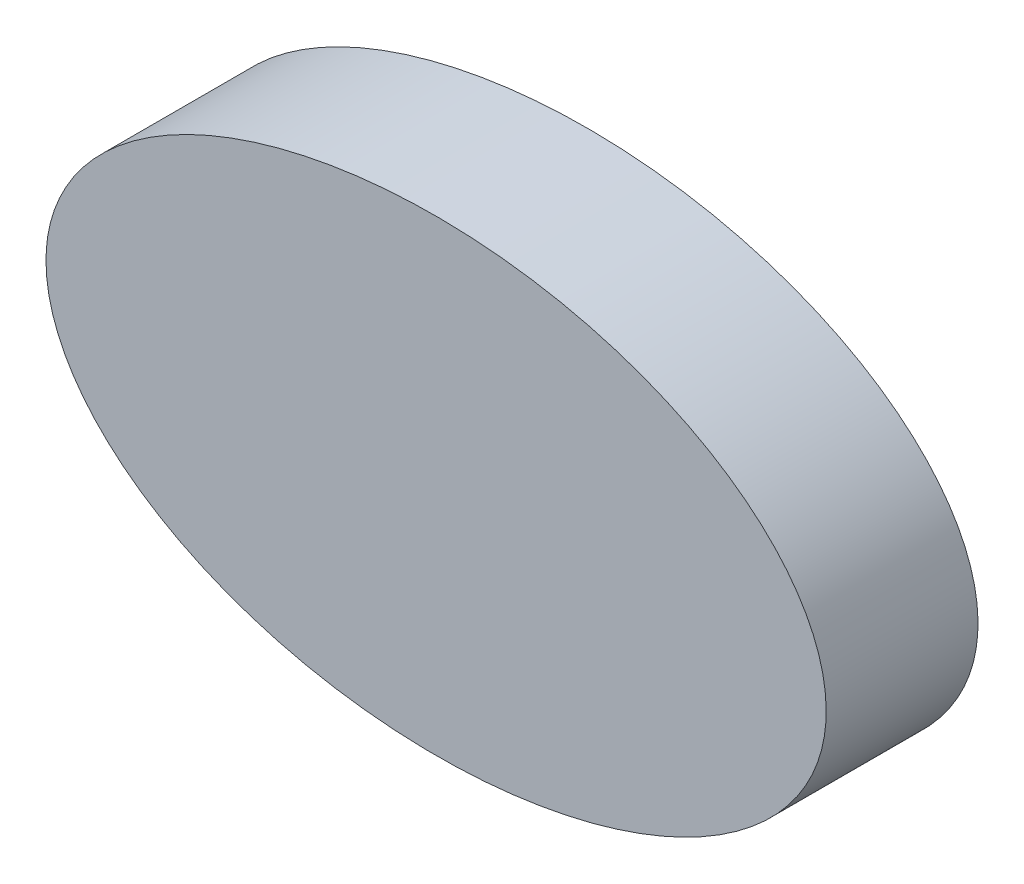
ISO-10303-21;
HEADER;
FILE_DESCRIPTION(('STEP AP214'),'2;1');
FILE_NAME('part.step','',(''),(''),'','','');
FILE_SCHEMA(('AUTOMOTIVE_DESIGN { 1 0 10303 214 1 1 1 1 }'));
ENDSEC;
DATA;
#1=APPLICATION_CONTEXT('core data for automotive mechanical design processes');
#2=APPLICATION_PROTOCOL_DEFINITION('international standard','automotive_design',2000,#1);
#3=PRODUCT_CONTEXT('',#1,'mechanical');
#4=PRODUCT('Part','Part','',(#3));
#5=PRODUCT_RELATED_PRODUCT_CATEGORY('part','',(#4));
#6=PRODUCT_DEFINITION_FORMATION('','',#4);
#7=PRODUCT_DEFINITION_CONTEXT('part definition',#1,'design');
#8=PRODUCT_DEFINITION('design','',#6,#7);
#9=PRODUCT_DEFINITION_SHAPE('','',#8);
#10=(LENGTH_UNIT() NAMED_UNIT(*) SI_UNIT(.MILLI.,.METRE.));
#11=(NAMED_UNIT(*) PLANE_ANGLE_UNIT() SI_UNIT($,.RADIAN.));
#12=(NAMED_UNIT(*) SI_UNIT($,.STERADIAN.) SOLID_ANGLE_UNIT());
#13=UNCERTAINTY_MEASURE_WITH_UNIT(LENGTH_MEASURE(1.E-05),#10,'distance_accuracy_value','');
#14=(GEOMETRIC_REPRESENTATION_CONTEXT(3) GLOBAL_UNCERTAINTY_ASSIGNED_CONTEXT((#13)) GLOBAL_UNIT_ASSIGNED_CONTEXT((#10,
#11,#12)) REPRESENTATION_CONTEXT('',''));
#15=CARTESIAN_POINT('',(0.,0.,0.));
#16=DIRECTION('',(0.,0.,1.));
#17=DIRECTION('',(1.,0.,0.));
#18=AXIS2_PLACEMENT_3D('',#15,#16,#17);
#19=CARTESIAN_POINT('',(0.,0.,16.51));
#20=DIRECTION('',(0.,0.,1.));
#21=DIRECTION('',(-1.,0.,0.));
#22=AXIS2_PLACEMENT_3D('',#19,#20,#21);
#23=ELLIPSE('',#22,42.418,25.4);
#24=DIRECTION('',(0.,0.,-1.));
#25=VECTOR('',#24,1.);
#26=SURFACE_OF_LINEAR_EXTRUSION('',#23,#25);
#27=CARTESIAN_POINT('',(-42.418,0.,16.51));
#28=VERTEX_POINT('',#27);
#29=EDGE_CURVE('E10',#28,#28,#23,.T.);
#30=ORIENTED_EDGE('',*,*,#29,.F.);
#31=EDGE_LOOP('',(#30));
#32=FACE_BOUND('',#31,.T.);
#33=CARTESIAN_POINT('',(0.,0.,0.));
#34=DIRECTION('',(0.,0.,1.));
#35=DIRECTION('',(-1.,0.,0.));
#36=AXIS2_PLACEMENT_3D('',#33,#34,#35);
#37=ELLIPSE('',#36,42.418,25.4);
#38=CARTESIAN_POINT('',(-42.418,0.,0.));
#39=VERTEX_POINT('',#38);
#40=EDGE_CURVE('E35',#39,#39,#37,.T.);
#41=ORIENTED_EDGE('',*,*,#40,.T.);
#42=EDGE_LOOP('',(#41));
#43=FACE_BOUND('',#42,.T.);
#44=ADVANCED_FACE('F31',(#32,#43),#26,.F.);
#45=CARTESIAN_POINT('',(0.,0.,16.51));
#46=DIRECTION('',(0.,0.,1.));
#47=DIRECTION('',(1.,0.,0.));
#48=AXIS2_PLACEMENT_3D('',#45,#46,#47);
#49=PLANE('',#48);
#50=ORIENTED_EDGE('',*,*,#29,.T.);
#51=EDGE_LOOP('',(#50));
#52=FACE_BOUND('',#51,.T.);
#53=ADVANCED_FACE('F47',(#52),#49,.T.);
#54=CARTESIAN_POINT('',(0.,0.,0.));
#55=DIRECTION('',(0.,0.,1.));
#56=DIRECTION('',(1.,0.,0.));
#57=AXIS2_PLACEMENT_3D('',#54,#55,#56);
#58=PLANE('',#57);
#59=ORIENTED_EDGE('',*,*,#40,.F.);
#60=EDGE_LOOP('',(#59));
#61=FACE_BOUND('',#60,.T.);
#62=ADVANCED_FACE('F45',(#61),#58,.F.);
#63=CLOSED_SHELL('',(#44,#53,#62));
#64=MANIFOLD_SOLID_BREP('B2',#63);
#65=ADVANCED_BREP_SHAPE_REPRESENTATION('',(#18,#64),#14);
#66=SHAPE_DEFINITION_REPRESENTATION(#9,#65);
ENDSEC;
END-ISO-10303-21;
